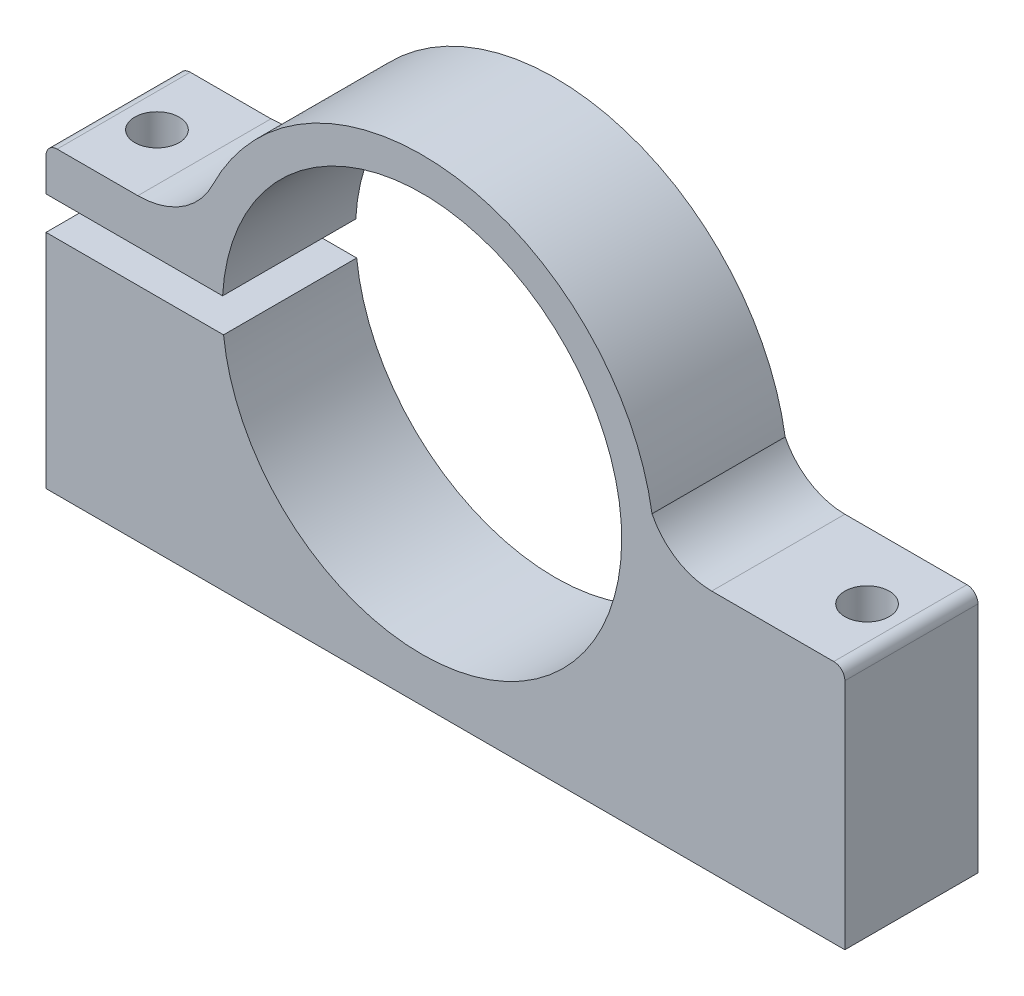
ISO-10303-21;
HEADER;
FILE_DESCRIPTION(('STEP AP214'),'2;1');
FILE_NAME('part.step','',(''),(''),'','','');
FILE_SCHEMA(('AUTOMOTIVE_DESIGN { 1 0 10303 214 1 1 1 1 }'));
ENDSEC;
DATA;
#1=APPLICATION_CONTEXT('core data for automotive mechanical design processes');
#2=APPLICATION_PROTOCOL_DEFINITION('international standard','automotive_design',2000,#1);
#3=PRODUCT_CONTEXT('',#1,'mechanical');
#4=PRODUCT('Part','Part','',(#3));
#5=PRODUCT_RELATED_PRODUCT_CATEGORY('part','',(#4));
#6=PRODUCT_DEFINITION_FORMATION('','',#4);
#7=PRODUCT_DEFINITION_CONTEXT('part definition',#1,'design');
#8=PRODUCT_DEFINITION('design','',#6,#7);
#9=PRODUCT_DEFINITION_SHAPE('','',#8);
#10=(LENGTH_UNIT() NAMED_UNIT(*) SI_UNIT(.MILLI.,.METRE.));
#11=(NAMED_UNIT(*) PLANE_ANGLE_UNIT() SI_UNIT($,.RADIAN.));
#12=(NAMED_UNIT(*) SI_UNIT($,.STERADIAN.) SOLID_ANGLE_UNIT());
#13=UNCERTAINTY_MEASURE_WITH_UNIT(LENGTH_MEASURE(1.E-05),#10,'distance_accuracy_value','');
#14=(GEOMETRIC_REPRESENTATION_CONTEXT(3) GLOBAL_UNCERTAINTY_ASSIGNED_CONTEXT((#13)) GLOBAL_UNIT_ASSIGNED_CONTEXT((#10,
#11,#12)) REPRESENTATION_CONTEXT('',''));
#15=CARTESIAN_POINT('',(0.,0.,0.));
#16=DIRECTION('',(0.,0.,1.));
#17=DIRECTION('',(1.,0.,0.));
#18=AXIS2_PLACEMENT_3D('',#15,#16,#17);
#19=CARTESIAN_POINT('',(0.,0.,12.));
#20=DIRECTION('',(-1.,0.,0.));
#21=DIRECTION('',(0.,0.,1.));
#22=AXIS2_PLACEMENT_3D('',#19,#20,#21);
#23=PLANE('',#22);
#24=DIRECTION('',(0.,1.,0.));
#25=VECTOR('',#24,1.);
#26=CARTESIAN_POINT('',(0.,0.,0.));
#27=LINE('',#26,#25);
#28=CARTESIAN_POINT('',(0.,0.,0.));
#29=VERTEX_POINT('',#28);
#30=CARTESIAN_POINT('',(0.,20.,0.));
#31=VERTEX_POINT('',#30);
#32=EDGE_CURVE('E190',#29,#31,#27,.T.);
#33=ORIENTED_EDGE('',*,*,#32,.F.);
#34=DIRECTION('',(0.,0.,-1.));
#35=VECTOR('',#34,1.);
#36=CARTESIAN_POINT('',(0.,0.,12.));
#37=LINE('',#36,#35);
#38=CARTESIAN_POINT('',(0.,0.,12.));
#39=VERTEX_POINT('',#38);
#40=EDGE_CURVE('E158',#39,#29,#37,.T.);
#41=ORIENTED_EDGE('',*,*,#40,.F.);
#42=DIRECTION('',(0.,1.,0.));
#43=VECTOR('',#42,1.);
#44=CARTESIAN_POINT('',(0.,0.,12.));
#45=LINE('',#44,#43);
#46=CARTESIAN_POINT('',(0.,20.,12.));
#47=VERTEX_POINT('',#46);
#48=EDGE_CURVE('E153',#39,#47,#45,.T.);
#49=ORIENTED_EDGE('',*,*,#48,.T.);
#50=DIRECTION('',(0.,0.,-1.));
#51=VECTOR('',#50,1.);
#52=CARTESIAN_POINT('',(0.,20.,12.));
#53=LINE('',#52,#51);
#54=EDGE_CURVE('E136',#47,#31,#53,.T.);
#55=ORIENTED_EDGE('',*,*,#54,.T.);
#56=EDGE_LOOP('',(#33,#41,#49,#55));
#57=FACE_BOUND('',#56,.T.);
#58=ADVANCED_FACE('F35',(#57),#23,.T.);
#59=CARTESIAN_POINT('',(0.,0.,12.));
#60=DIRECTION('',(0.,1.,0.));
#61=DIRECTION('',(0.,0.,1.));
#62=AXIS2_PLACEMENT_3D('',#59,#60,#61);
#63=PLANE('',#62);
#64=CARTESIAN_POINT('',(68.,0.,6.));
#65=DIRECTION('',(0.,-1.,0.));
#66=DIRECTION('',(0.,0.,-1.));
#67=AXIS2_PLACEMENT_3D('',#64,#65,#66);
#68=CIRCLE('',#67,2.);
#69=CARTESIAN_POINT('',(68.,0.,4.));
#70=VERTEX_POINT('',#69);
#71=EDGE_CURVE('E244',#70,#70,#68,.T.);
#72=ORIENTED_EDGE('',*,*,#71,.F.);
#73=EDGE_LOOP('',(#72));
#74=FACE_BOUND('',#73,.T.);
#75=CARTESIAN_POINT('',(4.,0.,6.));
#76=DIRECTION('',(0.,-1.,0.));
#77=DIRECTION('',(0.,0.,-1.));
#78=AXIS2_PLACEMENT_3D('',#75,#76,#77);
#79=CIRCLE('',#78,2.);
#80=CARTESIAN_POINT('',(4.,0.,4.));
#81=VERTEX_POINT('',#80);
#82=EDGE_CURVE('E240',#81,#81,#79,.T.);
#83=ORIENTED_EDGE('',*,*,#82,.F.);
#84=EDGE_LOOP('',(#83));
#85=FACE_BOUND('',#84,.T.);
#86=DIRECTION('',(1.,0.,0.));
#87=VECTOR('',#86,1.);
#88=CARTESIAN_POINT('',(0.,0.,0.));
#89=LINE('',#88,#87);
#90=CARTESIAN_POINT('',(72.,0.,0.));
#91=VERTEX_POINT('',#90);
#92=EDGE_CURVE('E160',#29,#91,#89,.T.);
#93=ORIENTED_EDGE('',*,*,#92,.T.);
#94=DIRECTION('',(0.,0.,-1.));
#95=VECTOR('',#94,1.);
#96=CARTESIAN_POINT('',(72.,0.,12.));
#97=LINE('',#96,#95);
#98=CARTESIAN_POINT('',(72.,0.,12.));
#99=VERTEX_POINT('',#98);
#100=EDGE_CURVE('E218',#99,#91,#97,.T.);
#101=ORIENTED_EDGE('',*,*,#100,.F.);
#102=DIRECTION('',(1.,0.,0.));
#103=VECTOR('',#102,1.);
#104=CARTESIAN_POINT('',(0.,0.,12.));
#105=LINE('',#104,#103);
#106=EDGE_CURVE('E147',#39,#99,#105,.T.);
#107=ORIENTED_EDGE('',*,*,#106,.F.);
#108=ORIENTED_EDGE('',*,*,#40,.T.);
#109=EDGE_LOOP('',(#93,#101,#107,#108));
#110=FACE_BOUND('',#109,.T.);
#111=ADVANCED_FACE('F299',(#74,#85,#110),#63,.F.);
#112=CARTESIAN_POINT('',(72.,0.,12.));
#113=DIRECTION('',(-1.,0.,0.));
#114=DIRECTION('',(0.,0.,1.));
#115=AXIS2_PLACEMENT_3D('',#112,#113,#114);
#116=PLANE('',#115);
#117=DIRECTION('',(0.,1.,0.));
#118=VECTOR('',#117,1.);
#119=CARTESIAN_POINT('',(72.,0.,0.));
#120=LINE('',#119,#118);
#121=CARTESIAN_POINT('',(72.,21.,0.));
#122=VERTEX_POINT('',#121);
#123=EDGE_CURVE('E162',#91,#122,#120,.T.);
#124=ORIENTED_EDGE('',*,*,#123,.T.);
#125=DIRECTION('',(0.,0.,-1.));
#126=VECTOR('',#125,1.);
#127=CARTESIAN_POINT('',(72.,21.,12.));
#128=LINE('',#127,#126);
#129=CARTESIAN_POINT('',(72.,21.,12.));
#130=VERTEX_POINT('',#129);
#131=EDGE_CURVE('E11',#122,#130,#128,.F.);
#132=ORIENTED_EDGE('',*,*,#131,.T.);
#133=DIRECTION('',(0.,1.,0.));
#134=VECTOR('',#133,1.);
#135=CARTESIAN_POINT('',(72.,0.,12.));
#136=LINE('',#135,#134);
#137=EDGE_CURVE('E187',#99,#130,#136,.T.);
#138=ORIENTED_EDGE('',*,*,#137,.F.);
#139=ORIENTED_EDGE('',*,*,#100,.T.);
#140=EDGE_LOOP('',(#124,#132,#138,#139));
#141=FACE_BOUND('',#140,.T.);
#142=ADVANCED_FACE('F300',(#141),#116,.F.);
#143=CARTESIAN_POINT('',(72.,22.,12.));
#144=DIRECTION('',(0.,-1.,0.));
#145=DIRECTION('',(0.,0.,-1.));
#146=AXIS2_PLACEMENT_3D('',#143,#144,#145);
#147=PLANE('',#146);
#148=CARTESIAN_POINT('',(68.,22.,6.));
#149=DIRECTION('',(0.,-1.,0.));
#150=DIRECTION('',(0.,0.,-1.));
#151=AXIS2_PLACEMENT_3D('',#148,#149,#150);
#152=CIRCLE('',#151,2.);
#153=CARTESIAN_POINT('',(68.,22.,4.));
#154=VERTEX_POINT('',#153);
#155=EDGE_CURVE('E241',#154,#154,#152,.T.);
#156=ORIENTED_EDGE('',*,*,#155,.T.);
#157=EDGE_LOOP('',(#156));
#158=FACE_BOUND('',#157,.T.);
#159=DIRECTION('',(-1.,0.,0.));
#160=VECTOR('',#159,1.);
#161=CARTESIAN_POINT('',(72.,22.,12.));
#162=LINE('',#161,#160);
#163=CARTESIAN_POINT('',(71.,22.,12.));
#164=VERTEX_POINT('',#163);
#165=CARTESIAN_POINT('',(60.,22.,12.));
#166=VERTEX_POINT('',#165);
#167=EDGE_CURVE('E185',#164,#166,#162,.T.);
#168=ORIENTED_EDGE('',*,*,#167,.F.);
#169=DIRECTION('',(0.,0.,-1.));
#170=VECTOR('',#169,1.);
#171=CARTESIAN_POINT('',(71.,22.,12.));
#172=LINE('',#171,#170);
#173=CARTESIAN_POINT('',(71.,22.,0.));
#174=VERTEX_POINT('',#173);
#175=EDGE_CURVE('E43',#164,#174,#172,.T.);
#176=ORIENTED_EDGE('',*,*,#175,.T.);
#177=DIRECTION('',(-1.,0.,0.));
#178=VECTOR('',#177,1.);
#179=CARTESIAN_POINT('',(72.,22.,0.));
#180=LINE('',#179,#178);
#181=CARTESIAN_POINT('',(60.,22.,0.));
#182=VERTEX_POINT('',#181);
#183=EDGE_CURVE('E213',#174,#182,#180,.T.);
#184=ORIENTED_EDGE('',*,*,#183,.T.);
#185=DIRECTION('',(0.,0.,-1.));
#186=VECTOR('',#185,1.);
#187=CARTESIAN_POINT('',(60.,22.,12.));
#188=LINE('',#187,#186);
#189=EDGE_CURVE('E221',#166,#182,#188,.T.);
#190=ORIENTED_EDGE('',*,*,#189,.F.);
#191=EDGE_LOOP('',(#168,#176,#184,#190));
#192=FACE_BOUND('',#191,.T.);
#193=ADVANCED_FACE('F259',(#158,#192),#147,.F.);
#194=CARTESIAN_POINT('',(60.,28.,12.));
#195=DIRECTION('',(0.,0.,-1.));
#196=DIRECTION('',(-1.,0.,0.));
#197=AXIS2_PLACEMENT_3D('',#194,#195,#196);
#198=CYLINDRICAL_SURFACE('',#197,6.);
#199=CARTESIAN_POINT('',(60.,28.,0.));
#200=DIRECTION('',(0.,0.,-1.));
#201=DIRECTION('',(-1.,0.,0.));
#202=AXIS2_PLACEMENT_3D('',#199,#200,#201);
#203=CIRCLE('',#202,6.);
#204=CARTESIAN_POINT('',(54.6209302283055,25.3418787854496,0.));
#205=VERTEX_POINT('',#204);
#206=EDGE_CURVE('E210',#182,#205,#203,.T.);
#207=ORIENTED_EDGE('',*,*,#206,.T.);
#208=DIRECTION('',(0.,0.,-1.));
#209=VECTOR('',#208,1.);
#210=CARTESIAN_POINT('',(54.6209302283055,25.3418787854496,12.));
#211=LINE('',#210,#209);
#212=CARTESIAN_POINT('',(54.6209302283055,25.3418787854496,12.));
#213=VERTEX_POINT('',#212);
#214=EDGE_CURVE('E224',#213,#205,#211,.T.);
#215=ORIENTED_EDGE('',*,*,#214,.F.);
#216=CARTESIAN_POINT('',(60.,28.,12.));
#217=DIRECTION('',(0.,0.,-1.));
#218=DIRECTION('',(-1.,0.,0.));
#219=AXIS2_PLACEMENT_3D('',#216,#217,#218);
#220=CIRCLE('',#219,6.);
#221=EDGE_CURVE('E183',#166,#213,#220,.T.);
#222=ORIENTED_EDGE('',*,*,#221,.F.);
#223=ORIENTED_EDGE('',*,*,#189,.T.);
#224=EDGE_LOOP('',(#207,#215,#222,#223));
#225=FACE_BOUND('',#224,.T.);
#226=ADVANCED_FACE('F269',(#225),#198,.F.);
#227=CARTESIAN_POINT('',(33.8885438199983,22.,12.));
#228=DIRECTION('',(0.,0.,-1.));
#229=DIRECTION('',(-1.,0.,0.));
#230=AXIS2_PLACEMENT_3D('',#227,#228,#229);
#231=CYLINDRICAL_SURFACE('',#230,21.);
#232=CARTESIAN_POINT('',(33.8885438199983,22.,0.));
#233=DIRECTION('',(0.,0.,-1.));
#234=DIRECTION('',(-1.,0.,0.));
#235=AXIS2_PLACEMENT_3D('',#232,#233,#234);
#236=CIRCLE('',#235,21.);
#237=CARTESIAN_POINT('',(15.016177646512,31.2105263157895,0.));
#238=VERTEX_POINT('',#237);
#239=EDGE_CURVE('E207',#238,#205,#236,.T.);
#240=ORIENTED_EDGE('',*,*,#239,.F.);
#241=DIRECTION('',(0.,0.,-1.));
#242=VECTOR('',#241,1.);
#243=CARTESIAN_POINT('',(15.016177646512,31.2105263157895,12.));
#244=LINE('',#243,#242);
#245=CARTESIAN_POINT('',(15.016177646512,31.2105263157895,12.));
#246=VERTEX_POINT('',#245);
#247=EDGE_CURVE('E226',#246,#238,#244,.T.);
#248=ORIENTED_EDGE('',*,*,#247,.F.);
#249=CARTESIAN_POINT('',(33.8885438199983,22.,12.));
#250=DIRECTION('',(0.,0.,-1.));
#251=DIRECTION('',(-1.,0.,0.));
#252=AXIS2_PLACEMENT_3D('',#249,#250,#251);
#253=CIRCLE('',#252,21.);
#254=EDGE_CURVE('E180',#246,#213,#253,.T.);
#255=ORIENTED_EDGE('',*,*,#254,.T.);
#256=ORIENTED_EDGE('',*,*,#214,.T.);
#257=EDGE_LOOP('',(#240,#248,#255,#256));
#258=FACE_BOUND('',#257,.T.);
#259=ADVANCED_FACE('F329',(#258),#231,.T.);
#260=CARTESIAN_POINT('',(8.27604687026692,34.5,12.));
#261=DIRECTION('',(0.,0.,-1.));
#262=DIRECTION('',(-1.,0.,0.));
#263=AXIS2_PLACEMENT_3D('',#260,#261,#262);
#264=CYLINDRICAL_SURFACE('',#263,7.5);
#265=CARTESIAN_POINT('',(8.27604687026692,34.5,0.));
#266=DIRECTION('',(0.,0.,1.));
#267=DIRECTION('',(1.,0.,0.));
#268=AXIS2_PLACEMENT_3D('',#265,#266,#267);
#269=CIRCLE('',#268,7.5);
#270=CARTESIAN_POINT('',(8.27604687026692,27.,0.));
#271=VERTEX_POINT('',#270);
#272=EDGE_CURVE('E204',#271,#238,#269,.T.);
#273=ORIENTED_EDGE('',*,*,#272,.F.);
#274=DIRECTION('',(0.,0.,-1.));
#275=VECTOR('',#274,1.);
#276=CARTESIAN_POINT('',(8.27604687026692,27.,12.));
#277=LINE('',#276,#275);
#278=CARTESIAN_POINT('',(8.27604687026692,27.,12.));
#279=VERTEX_POINT('',#278);
#280=EDGE_CURVE('E228',#279,#271,#277,.T.);
#281=ORIENTED_EDGE('',*,*,#280,.F.);
#282=CARTESIAN_POINT('',(8.27604687026692,34.5,12.));
#283=DIRECTION('',(0.,0.,1.));
#284=DIRECTION('',(1.,0.,0.));
#285=AXIS2_PLACEMENT_3D('',#282,#283,#284);
#286=CIRCLE('',#285,7.5);
#287=EDGE_CURVE('E177',#279,#246,#286,.T.);
#288=ORIENTED_EDGE('',*,*,#287,.T.);
#289=ORIENTED_EDGE('',*,*,#247,.T.);
#290=EDGE_LOOP('',(#273,#281,#288,#289));
#291=FACE_BOUND('',#290,.T.);
#292=ADVANCED_FACE('F277',(#291),#264,.F.);
#293=CARTESIAN_POINT('',(0.,27.,12.));
#294=DIRECTION('',(0.,1.,0.));
#295=DIRECTION('',(0.,0.,1.));
#296=AXIS2_PLACEMENT_3D('',#293,#294,#295);
#297=PLANE('',#296);
#298=CARTESIAN_POINT('',(4.,27.,6.));
#299=DIRECTION('',(0.,1.,0.));
#300=DIRECTION('',(0.,0.,1.));
#301=AXIS2_PLACEMENT_3D('',#298,#299,#300);
#302=CIRCLE('',#301,2.);
#303=CARTESIAN_POINT('',(4.,27.,8.));
#304=VERTEX_POINT('',#303);
#305=EDGE_CURVE('E165',#304,#304,#302,.T.);
#306=ORIENTED_EDGE('',*,*,#305,.F.);
#307=EDGE_LOOP('',(#306));
#308=FACE_BOUND('',#307,.T.);
#309=DIRECTION('',(1.,0.,0.));
#310=VECTOR('',#309,1.);
#311=CARTESIAN_POINT('',(0.,27.,0.));
#312=LINE('',#311,#310);
#313=CARTESIAN_POINT('',(1.,27.,0.));
#314=VERTEX_POINT('',#313);
#315=EDGE_CURVE('E202',#314,#271,#312,.T.);
#316=ORIENTED_EDGE('',*,*,#315,.F.);
#317=DIRECTION('',(0.,0.,-1.));
#318=VECTOR('',#317,1.);
#319=CARTESIAN_POINT('',(1.,27.,12.));
#320=LINE('',#319,#318);
#321=CARTESIAN_POINT('',(1.,27.,12.));
#322=VERTEX_POINT('',#321);
#323=EDGE_CURVE('E251',#314,#322,#320,.F.);
#324=ORIENTED_EDGE('',*,*,#323,.T.);
#325=DIRECTION('',(1.,0.,0.));
#326=VECTOR('',#325,1.);
#327=CARTESIAN_POINT('',(0.,27.,12.));
#328=LINE('',#327,#326);
#329=EDGE_CURVE('E175',#322,#279,#328,.T.);
#330=ORIENTED_EDGE('',*,*,#329,.T.);
#331=ORIENTED_EDGE('',*,*,#280,.T.);
#332=EDGE_LOOP('',(#316,#324,#330,#331));
#333=FACE_BOUND('',#332,.T.);
#334=ADVANCED_FACE('F280',(#308,#333),#297,.T.);
#335=CARTESIAN_POINT('',(0.,23.,12.));
#336=DIRECTION('',(-1.,0.,0.));
#337=DIRECTION('',(0.,-1.,0.));
#338=AXIS2_PLACEMENT_3D('',#335,#336,#337);
#339=PLANE('',#338);
#340=DIRECTION('',(0.,1.,0.));
#341=VECTOR('',#340,1.);
#342=CARTESIAN_POINT('',(0.,23.,12.));
#343=LINE('',#342,#341);
#344=CARTESIAN_POINT('',(0.,23.,12.));
#345=VERTEX_POINT('',#344);
#346=CARTESIAN_POINT('',(0.,26.,12.));
#347=VERTEX_POINT('',#346);
#348=EDGE_CURVE('E172',#345,#347,#343,.T.);
#349=ORIENTED_EDGE('',*,*,#348,.T.);
#350=DIRECTION('',(0.,0.,-1.));
#351=VECTOR('',#350,1.);
#352=CARTESIAN_POINT('',(0.,26.,12.));
#353=LINE('',#352,#351);
#354=CARTESIAN_POINT('',(0.,26.,0.));
#355=VERTEX_POINT('',#354);
#356=EDGE_CURVE('E217',#347,#355,#353,.T.);
#357=ORIENTED_EDGE('',*,*,#356,.T.);
#358=DIRECTION('',(0.,1.,0.));
#359=VECTOR('',#358,1.);
#360=CARTESIAN_POINT('',(0.,23.,0.));
#361=LINE('',#360,#359);
#362=CARTESIAN_POINT('',(0.,23.,0.));
#363=VERTEX_POINT('',#362);
#364=EDGE_CURVE('E199',#363,#355,#361,.T.);
#365=ORIENTED_EDGE('',*,*,#364,.F.);
#366=DIRECTION('',(0.,0.,-1.));
#367=VECTOR('',#366,1.);
#368=CARTESIAN_POINT('',(0.,23.,12.));
#369=LINE('',#368,#367);
#370=EDGE_CURVE('E231',#345,#363,#369,.T.);
#371=ORIENTED_EDGE('',*,*,#370,.F.);
#372=EDGE_LOOP('',(#349,#357,#365,#371));
#373=FACE_BOUND('',#372,.T.);
#374=ADVANCED_FACE('F289',(#373),#339,.T.);
#375=CARTESIAN_POINT('',(15.9163430643869,23.,12.));
#376=DIRECTION('',(0.,-1.,0.));
#377=DIRECTION('',(1.,0.,0.));
#378=AXIS2_PLACEMENT_3D('',#375,#376,#377);
#379=PLANE('',#378);
#380=CARTESIAN_POINT('',(4.,23.,6.));
#381=DIRECTION('',(0.,-1.,0.));
#382=DIRECTION('',(1.,0.,0.));
#383=AXIS2_PLACEMENT_3D('',#380,#381,#382);
#384=CIRCLE('',#383,2.);
#385=CARTESIAN_POINT('',(6.,23.,6.));
#386=VERTEX_POINT('',#385);
#387=EDGE_CURVE('E239',#386,#386,#384,.T.);
#388=ORIENTED_EDGE('',*,*,#387,.F.);
#389=EDGE_LOOP('',(#388));
#390=FACE_BOUND('',#389,.T.);
#391=DIRECTION('',(-1.,0.,0.));
#392=VECTOR('',#391,1.);
#393=CARTESIAN_POINT('',(15.9163430643869,23.,0.));
#394=LINE('',#393,#392);
#395=CARTESIAN_POINT('',(15.9163430643869,23.,0.));
#396=VERTEX_POINT('',#395);
#397=EDGE_CURVE('E196',#396,#363,#394,.T.);
#398=ORIENTED_EDGE('',*,*,#397,.F.);
#399=DIRECTION('',(0.,0.,-1.));
#400=VECTOR('',#399,1.);
#401=CARTESIAN_POINT('',(15.9163430643869,23.,12.));
#402=LINE('',#401,#400);
#403=CARTESIAN_POINT('',(15.9163430643869,23.,12.));
#404=VERTEX_POINT('',#403);
#405=EDGE_CURVE('E233',#404,#396,#402,.T.);
#406=ORIENTED_EDGE('',*,*,#405,.F.);
#407=DIRECTION('',(-1.,0.,0.));
#408=VECTOR('',#407,1.);
#409=CARTESIAN_POINT('',(15.9163430643869,23.,12.));
#410=LINE('',#409,#408);
#411=EDGE_CURVE('E169',#404,#345,#410,.T.);
#412=ORIENTED_EDGE('',*,*,#411,.T.);
#413=ORIENTED_EDGE('',*,*,#370,.T.);
#414=EDGE_LOOP('',(#398,#406,#412,#413));
#415=FACE_BOUND('',#414,.T.);
#416=ADVANCED_FACE('F293',(#390,#415),#379,.T.);
#417=CARTESIAN_POINT('',(33.8885438199983,22.,12.));
#418=DIRECTION('',(0.,0.,-1.));
#419=DIRECTION('',(-1.,0.,0.));
#420=AXIS2_PLACEMENT_3D('',#417,#418,#419);
#421=CYLINDRICAL_SURFACE('',#420,18.);
#422=CARTESIAN_POINT('',(33.8885438199983,22.,0.));
#423=DIRECTION('',(0.,0.,1.));
#424=DIRECTION('',(1.,0.,0.));
#425=AXIS2_PLACEMENT_3D('',#422,#423,#424);
#426=CIRCLE('',#425,18.);
#427=CARTESIAN_POINT('',(16.,20.,0.));
#428=VERTEX_POINT('',#427);
#429=EDGE_CURVE('E193',#428,#396,#426,.T.);
#430=ORIENTED_EDGE('',*,*,#429,.F.);
#431=DIRECTION('',(0.,0.,-1.));
#432=VECTOR('',#431,1.);
#433=CARTESIAN_POINT('',(16.,20.,12.));
#434=LINE('',#433,#432);
#435=CARTESIAN_POINT('',(16.,20.,12.));
#436=VERTEX_POINT('',#435);
#437=EDGE_CURVE('E146',#436,#428,#434,.T.);
#438=ORIENTED_EDGE('',*,*,#437,.F.);
#439=CARTESIAN_POINT('',(33.8885438199983,22.,12.));
#440=DIRECTION('',(0.,0.,1.));
#441=DIRECTION('',(1.,0.,0.));
#442=AXIS2_PLACEMENT_3D('',#439,#440,#441);
#443=CIRCLE('',#442,18.);
#444=EDGE_CURVE('E156',#436,#404,#443,.T.);
#445=ORIENTED_EDGE('',*,*,#444,.T.);
#446=ORIENTED_EDGE('',*,*,#405,.T.);
#447=EDGE_LOOP('',(#430,#438,#445,#446));
#448=FACE_BOUND('',#447,.T.);
#449=ADVANCED_FACE('F295',(#448),#421,.F.);
#450=CARTESIAN_POINT('',(0.,20.,12.));
#451=DIRECTION('',(0.,1.,0.));
#452=DIRECTION('',(0.,0.,1.));
#453=AXIS2_PLACEMENT_3D('',#450,#451,#452);
#454=PLANE('',#453);
#455=CARTESIAN_POINT('',(4.,20.,6.));
#456=DIRECTION('',(0.,1.,0.));
#457=DIRECTION('',(0.,0.,1.));
#458=AXIS2_PLACEMENT_3D('',#455,#456,#457);
#459=CIRCLE('',#458,2.);
#460=CARTESIAN_POINT('',(4.,20.,8.));
#461=VERTEX_POINT('',#460);
#462=EDGE_CURVE('E236',#461,#461,#459,.T.);
#463=ORIENTED_EDGE('',*,*,#462,.F.);
#464=EDGE_LOOP('',(#463));
#465=FACE_BOUND('',#464,.T.);
#466=DIRECTION('',(1.,0.,0.));
#467=VECTOR('',#466,1.);
#468=CARTESIAN_POINT('',(0.,20.,0.));
#469=LINE('',#468,#467);
#470=EDGE_CURVE('E141',#31,#428,#469,.T.);
#471=ORIENTED_EDGE('',*,*,#470,.F.);
#472=ORIENTED_EDGE('',*,*,#54,.F.);
#473=DIRECTION('',(1.,0.,0.));
#474=VECTOR('',#473,1.);
#475=CARTESIAN_POINT('',(0.,20.,12.));
#476=LINE('',#475,#474);
#477=EDGE_CURVE('E139',#47,#436,#476,.T.);
#478=ORIENTED_EDGE('',*,*,#477,.T.);
#479=ORIENTED_EDGE('',*,*,#437,.T.);
#480=EDGE_LOOP('',(#471,#472,#478,#479));
#481=FACE_BOUND('',#480,.T.);
#482=ADVANCED_FACE('F138',(#465,#481),#454,.T.);
#483=CARTESIAN_POINT('',(33.8885438199983,22.,12.));
#484=DIRECTION('',(0.,0.,1.));
#485=DIRECTION('',(1.,0.,0.));
#486=AXIS2_PLACEMENT_3D('',#483,#484,#485);
#487=PLANE('',#486);
#488=ORIENTED_EDGE('',*,*,#329,.F.);
#489=CARTESIAN_POINT('',(1.,26.,12.));
#490=DIRECTION('',(0.,0.,1.));
#491=DIRECTION('',(1.,0.,0.));
#492=AXIS2_PLACEMENT_3D('',#489,#490,#491);
#493=CIRCLE('',#492,1.);
#494=EDGE_CURVE('E254',#322,#347,#493,.T.);
#495=ORIENTED_EDGE('',*,*,#494,.T.);
#496=ORIENTED_EDGE('',*,*,#348,.F.);
#497=ORIENTED_EDGE('',*,*,#411,.F.);
#498=ORIENTED_EDGE('',*,*,#444,.F.);
#499=ORIENTED_EDGE('',*,*,#477,.F.);
#500=ORIENTED_EDGE('',*,*,#48,.F.);
#501=ORIENTED_EDGE('',*,*,#106,.T.);
#502=ORIENTED_EDGE('',*,*,#137,.T.);
#503=CARTESIAN_POINT('',(71.,21.,12.));
#504=DIRECTION('',(0.,0.,1.));
#505=DIRECTION('',(1.,0.,0.));
#506=AXIS2_PLACEMENT_3D('',#503,#504,#505);
#507=CIRCLE('',#506,1.);
#508=EDGE_CURVE('E50',#130,#164,#507,.T.);
#509=ORIENTED_EDGE('',*,*,#508,.T.);
#510=ORIENTED_EDGE('',*,*,#167,.T.);
#511=ORIENTED_EDGE('',*,*,#221,.T.);
#512=ORIENTED_EDGE('',*,*,#254,.F.);
#513=ORIENTED_EDGE('',*,*,#287,.F.);
#514=EDGE_LOOP('',(#488,#495,#496,#497,#498,#499,#500,#501,#502,#509,#510,#511,#512,#513));
#515=FACE_BOUND('',#514,.T.);
#516=ADVANCED_FACE('F152',(#515),#487,.T.);
#517=CARTESIAN_POINT('',(33.8885438199983,22.,0.));
#518=DIRECTION('',(0.,0.,1.));
#519=DIRECTION('',(1.,0.,0.));
#520=AXIS2_PLACEMENT_3D('',#517,#518,#519);
#521=PLANE('',#520);
#522=ORIENTED_EDGE('',*,*,#364,.T.);
#523=CARTESIAN_POINT('',(1.,26.,0.));
#524=DIRECTION('',(0.,0.,1.));
#525=DIRECTION('',(1.,0.,0.));
#526=AXIS2_PLACEMENT_3D('',#523,#524,#525);
#527=CIRCLE('',#526,1.);
#528=EDGE_CURVE('E249',#355,#314,#527,.F.);
#529=ORIENTED_EDGE('',*,*,#528,.T.);
#530=ORIENTED_EDGE('',*,*,#315,.T.);
#531=ORIENTED_EDGE('',*,*,#272,.T.);
#532=ORIENTED_EDGE('',*,*,#239,.T.);
#533=ORIENTED_EDGE('',*,*,#206,.F.);
#534=ORIENTED_EDGE('',*,*,#183,.F.);
#535=CARTESIAN_POINT('',(71.,21.,0.));
#536=DIRECTION('',(0.,0.,1.));
#537=DIRECTION('',(1.,0.,0.));
#538=AXIS2_PLACEMENT_3D('',#535,#536,#537);
#539=CIRCLE('',#538,1.);
#540=EDGE_CURVE('E247',#174,#122,#539,.F.);
#541=ORIENTED_EDGE('',*,*,#540,.T.);
#542=ORIENTED_EDGE('',*,*,#123,.F.);
#543=ORIENTED_EDGE('',*,*,#92,.F.);
#544=ORIENTED_EDGE('',*,*,#32,.T.);
#545=ORIENTED_EDGE('',*,*,#470,.T.);
#546=ORIENTED_EDGE('',*,*,#429,.T.);
#547=ORIENTED_EDGE('',*,*,#397,.T.);
#548=EDGE_LOOP('',(#522,#529,#530,#531,#532,#533,#534,#541,#542,#543,#544,#545,#546,#547));
#549=FACE_BOUND('',#548,.T.);
#550=ADVANCED_FACE('F264',(#549),#521,.F.);
#551=CARTESIAN_POINT('',(4.,43.,6.));
#552=DIRECTION('',(0.,-1.,0.));
#553=DIRECTION('',(0.,0.,-1.));
#554=AXIS2_PLACEMENT_3D('',#551,#552,#553);
#555=CYLINDRICAL_SURFACE('',#554,2.);
#556=ORIENTED_EDGE('',*,*,#462,.T.);
#557=EDGE_LOOP('',(#556));
#558=FACE_BOUND('',#557,.T.);
#559=ORIENTED_EDGE('',*,*,#82,.T.);
#560=EDGE_LOOP('',(#559));
#561=FACE_BOUND('',#560,.T.);
#562=ADVANCED_FACE('F341',(#558,#561),#555,.F.);
#563=ORIENTED_EDGE('',*,*,#305,.T.);
#564=EDGE_LOOP('',(#563));
#565=FACE_BOUND('',#564,.T.);
#566=ORIENTED_EDGE('',*,*,#387,.T.);
#567=EDGE_LOOP('',(#566));
#568=FACE_BOUND('',#567,.T.);
#569=ADVANCED_FACE('F346',(#565,#568),#555,.F.);
#570=CARTESIAN_POINT('',(68.,32.,6.));
#571=DIRECTION('',(0.,-1.,0.));
#572=DIRECTION('',(0.,0.,-1.));
#573=AXIS2_PLACEMENT_3D('',#570,#571,#572);
#574=CYLINDRICAL_SURFACE('',#573,2.);
#575=ORIENTED_EDGE('',*,*,#71,.T.);
#576=EDGE_LOOP('',(#575));
#577=FACE_BOUND('',#576,.T.);
#578=ORIENTED_EDGE('',*,*,#155,.F.);
#579=EDGE_LOOP('',(#578));
#580=FACE_BOUND('',#579,.T.);
#581=ADVANCED_FACE('F305',(#577,#580),#574,.F.);
#582=CARTESIAN_POINT('',(1.,26.,12.));
#583=DIRECTION('',(0.,0.,-1.));
#584=DIRECTION('',(-1.,0.,0.));
#585=AXIS2_PLACEMENT_3D('',#582,#583,#584);
#586=CYLINDRICAL_SURFACE('',#585,1.);
#587=ORIENTED_EDGE('',*,*,#494,.F.);
#588=ORIENTED_EDGE('',*,*,#323,.F.);
#589=ORIENTED_EDGE('',*,*,#528,.F.);
#590=ORIENTED_EDGE('',*,*,#356,.F.);
#591=EDGE_LOOP('',(#587,#588,#589,#590));
#592=FACE_BOUND('',#591,.T.);
#593=ADVANCED_FACE('F286',(#592),#586,.T.);
#594=CARTESIAN_POINT('',(71.,21.,12.));
#595=DIRECTION('',(0.,0.,-1.));
#596=DIRECTION('',(-1.,0.,0.));
#597=AXIS2_PLACEMENT_3D('',#594,#595,#596);
#598=CYLINDRICAL_SURFACE('',#597,1.);
#599=ORIENTED_EDGE('',*,*,#508,.F.);
#600=ORIENTED_EDGE('',*,*,#131,.F.);
#601=ORIENTED_EDGE('',*,*,#540,.F.);
#602=ORIENTED_EDGE('',*,*,#175,.F.);
#603=EDGE_LOOP('',(#599,#600,#601,#602));
#604=FACE_BOUND('',#603,.T.);
#605=ADVANCED_FACE('F37',(#604),#598,.T.);
#606=CLOSED_SHELL('',(#58,#111,#142,#193,#226,#259,#292,#334,#374,#416,#449,#482,#516,#550,#562,
#569,#581,#593,#605));
#607=MANIFOLD_SOLID_BREP('B2',#606);
#608=ADVANCED_BREP_SHAPE_REPRESENTATION('',(#18,#607),#14);
#609=SHAPE_DEFINITION_REPRESENTATION(#9,#608);
ENDSEC;
END-ISO-10303-21;
